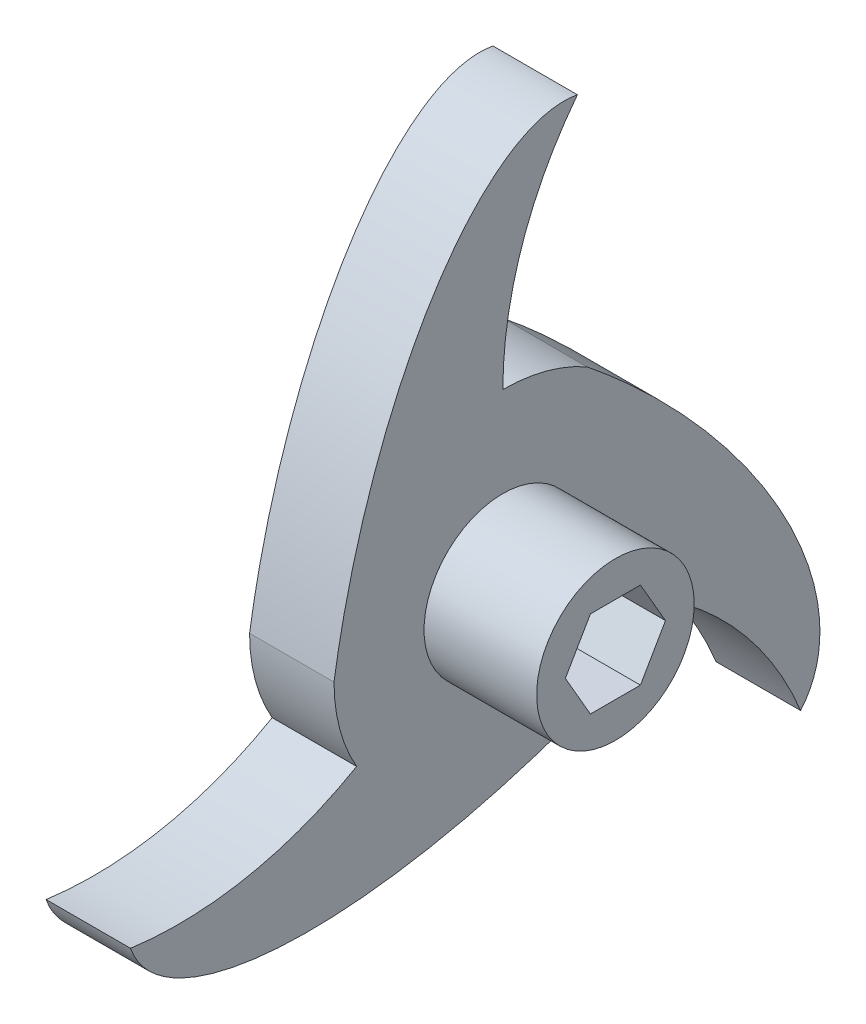
ISO-10303-21;
HEADER;
FILE_DESCRIPTION(('STEP AP214'),'2;1');
FILE_NAME('part.step','',(''),(''),'','','');
FILE_SCHEMA(('AUTOMOTIVE_DESIGN { 1 0 10303 214 1 1 1 1 }'));
ENDSEC;
DATA;
#1=APPLICATION_CONTEXT('core data for automotive mechanical design processes');
#2=APPLICATION_PROTOCOL_DEFINITION('international standard','automotive_design',2000,#1);
#3=PRODUCT_CONTEXT('',#1,'mechanical');
#4=PRODUCT('Part','Part','',(#3));
#5=PRODUCT_RELATED_PRODUCT_CATEGORY('part','',(#4));
#6=PRODUCT_DEFINITION_FORMATION('','',#4);
#7=PRODUCT_DEFINITION_CONTEXT('part definition',#1,'design');
#8=PRODUCT_DEFINITION('design','',#6,#7);
#9=PRODUCT_DEFINITION_SHAPE('','',#8);
#10=(LENGTH_UNIT() NAMED_UNIT(*) SI_UNIT(.MILLI.,.METRE.));
#11=(NAMED_UNIT(*) PLANE_ANGLE_UNIT() SI_UNIT($,.RADIAN.));
#12=(NAMED_UNIT(*) SI_UNIT($,.STERADIAN.) SOLID_ANGLE_UNIT());
#13=UNCERTAINTY_MEASURE_WITH_UNIT(LENGTH_MEASURE(1.E-05),#10,'distance_accuracy_value','');
#14=(GEOMETRIC_REPRESENTATION_CONTEXT(3) GLOBAL_UNCERTAINTY_ASSIGNED_CONTEXT((#13)) GLOBAL_UNIT_ASSIGNED_CONTEXT((#10,
#11,#12)) REPRESENTATION_CONTEXT('',''));
#15=CARTESIAN_POINT('',(0.,0.,0.));
#16=DIRECTION('',(0.,0.,1.));
#17=DIRECTION('',(1.,0.,0.));
#18=AXIS2_PLACEMENT_3D('',#15,#16,#17);
#19=CARTESIAN_POINT('',(9.525,0.,0.));
#20=DIRECTION('',(-1.,0.,0.));
#21=DIRECTION('',(0.,0.,1.));
#22=AXIS2_PLACEMENT_3D('',#19,#20,#21);
#23=CYLINDRICAL_SURFACE('',#22,19.05);
#24=CARTESIAN_POINT('',(0.,0.,0.));
#25=DIRECTION('',(1.,0.,0.));
#26=DIRECTION('',(0.,0.,-1.));
#27=AXIS2_PLACEMENT_3D('',#24,#25,#26);
#28=CIRCLE('',#27,19.05);
#29=CARTESIAN_POINT('',(0.,0.,19.05));
#30=VERTEX_POINT('',#29);
#31=CARTESIAN_POINT('',(0.,-9.52500000000001,16.4977839420936));
#32=VERTEX_POINT('',#31);
#33=EDGE_CURVE('E272',#30,#32,#28,.T.);
#34=ORIENTED_EDGE('',*,*,#33,.T.);
#35=DIRECTION('',(-1.,0.,0.));
#36=VECTOR('',#35,1.);
#37=CARTESIAN_POINT('',(9.525,-9.52500000000001,16.4977839420936));
#38=LINE('',#37,#36);
#39=CARTESIAN_POINT('',(9.525,-9.52500000000001,16.4977839420936));
#40=VERTEX_POINT('',#39);
#41=EDGE_CURVE('E11',#40,#32,#38,.T.);
#42=ORIENTED_EDGE('',*,*,#41,.F.);
#43=CARTESIAN_POINT('',(9.525,0.,0.));
#44=DIRECTION('',(1.,0.,0.));
#45=DIRECTION('',(0.,0.,-1.));
#46=AXIS2_PLACEMENT_3D('',#43,#44,#45);
#47=CIRCLE('',#46,19.05);
#48=CARTESIAN_POINT('',(9.525,0.,19.05));
#49=VERTEX_POINT('',#48);
#50=EDGE_CURVE('E152',#49,#40,#47,.T.);
#51=ORIENTED_EDGE('',*,*,#50,.F.);
#52=DIRECTION('',(-1.,0.,0.));
#53=VECTOR('',#52,1.);
#54=CARTESIAN_POINT('',(9.525,0.,19.05));
#55=LINE('',#54,#53);
#56=EDGE_CURVE('E214',#49,#30,#55,.T.);
#57=ORIENTED_EDGE('',*,*,#56,.T.);
#58=EDGE_LOOP('',(#34,#42,#51,#57));
#59=FACE_BOUND('',#58,.T.);
#60=ADVANCED_FACE('F38',(#59),#23,.T.);
#61=CARTESIAN_POINT('',(9.525,25.255382401578,36.5782470841628));
#62=DIRECTION('',(-1.,0.,0.));
#63=DIRECTION('',(0.,0.,1.));
#64=AXIS2_PLACEMENT_3D('',#61,#62,#63);
#65=CYLINDRICAL_SURFACE('',#64,40.1609262841384);
#66=CARTESIAN_POINT('',(0.,25.255382401578,36.5782470841628));
#67=DIRECTION('',(1.,0.,0.));
#68=DIRECTION('',(0.,0.,-1.));
#69=AXIS2_PLACEMENT_3D('',#66,#67,#68);
#70=CIRCLE('',#69,40.1609262841384);
#71=CARTESIAN_POINT('',(0.,-14.5371206447957,42.0056498980631));
#72=VERTEX_POINT('',#71);
#73=EDGE_CURVE('E275',#32,#72,#70,.F.);
#74=ORIENTED_EDGE('',*,*,#73,.T.);
#75=DIRECTION('',(-1.,0.,0.));
#76=VECTOR('',#75,1.);
#77=CARTESIAN_POINT('',(9.525,-14.5371206447957,42.0056498980631));
#78=LINE('',#77,#76);
#79=CARTESIAN_POINT('',(9.525,-14.5371206447957,42.0056498980631));
#80=VERTEX_POINT('',#79);
#81=EDGE_CURVE('E48',#80,#72,#78,.T.);
#82=ORIENTED_EDGE('',*,*,#81,.F.);
#83=CARTESIAN_POINT('',(9.525,25.255382401578,36.5782470841628));
#84=DIRECTION('',(1.,0.,0.));
#85=DIRECTION('',(0.,0.,-1.));
#86=AXIS2_PLACEMENT_3D('',#83,#84,#85);
#87=CIRCLE('',#86,40.1609262841384);
#88=EDGE_CURVE('E122',#40,#80,#87,.F.);
#89=ORIENTED_EDGE('',*,*,#88,.F.);
#90=ORIENTED_EDGE('',*,*,#41,.T.);
#91=EDGE_LOOP('',(#74,#82,#89,#90));
#92=FACE_BOUND('',#91,.T.);
#93=ADVANCED_FACE('F196',(#92),#65,.F.);
#94=CARTESIAN_POINT('',(9.525,0.,0.));
#95=DIRECTION('',(1.,0.,0.));
#96=DIRECTION('',(0.,-0.327044333966158,0.945008996581849));
#97=AXIS2_PLACEMENT_3D('',#94,#95,#96);
#98=ELLIPSE('',#97,44.45,18.7675000379589);
#99=DIRECTION('',(-1.,0.,0.));
#100=VECTOR('',#99,1.);
#101=SURFACE_OF_LINEAR_EXTRUSION('',#98,#100);
#102=CARTESIAN_POINT('',(0.,0.,0.));
#103=DIRECTION('',(1.,0.,0.));
#104=DIRECTION('',(0.,-0.327044333966158,0.945008996581849));
#105=AXIS2_PLACEMENT_3D('',#102,#103,#104);
#106=ELLIPSE('',#105,44.45,18.7675000379589);
#107=CARTESIAN_POINT('',(0.,-16.4977839420936,-9.52500000000001));
#108=VERTEX_POINT('',#107);
#109=EDGE_CURVE('E278',#72,#108,#106,.T.);
#110=ORIENTED_EDGE('',*,*,#109,.T.);
#111=DIRECTION('',(-1.,0.,0.));
#112=VECTOR('',#111,1.);
#113=CARTESIAN_POINT('',(9.525,-16.4977839420936,-9.52500000000001));
#114=LINE('',#113,#112);
#115=CARTESIAN_POINT('',(9.525,-16.4977839420936,-9.52500000000001));
#116=VERTEX_POINT('',#115);
#117=EDGE_CURVE('E224',#116,#108,#114,.T.);
#118=ORIENTED_EDGE('',*,*,#117,.F.);
#119=EDGE_CURVE('E199',#80,#116,#98,.T.);
#120=ORIENTED_EDGE('',*,*,#119,.F.);
#121=ORIENTED_EDGE('',*,*,#81,.T.);
#122=EDGE_LOOP('',(#110,#118,#120,#121));
#123=FACE_BOUND('',#122,.T.);
#124=ADVANCED_FACE('F192',(#123),#101,.F.);
#125=CARTESIAN_POINT('',(0.,-9.525,-16.4977839420936));
#126=VERTEX_POINT('',#125);
#127=EDGE_CURVE('E276',#108,#126,#28,.T.);
#128=ORIENTED_EDGE('',*,*,#127,.T.);
#129=DIRECTION('',(-1.,0.,0.));
#130=VECTOR('',#129,1.);
#131=CARTESIAN_POINT('',(9.525,-9.525,-16.4977839420936));
#132=LINE('',#131,#130);
#133=CARTESIAN_POINT('',(9.525,-9.525,-16.4977839420936));
#134=VERTEX_POINT('',#133);
#135=EDGE_CURVE('E221',#134,#126,#132,.T.);
#136=ORIENTED_EDGE('',*,*,#135,.F.);
#137=EDGE_CURVE('E151',#116,#134,#47,.T.);
#138=ORIENTED_EDGE('',*,*,#137,.F.);
#139=ORIENTED_EDGE('',*,*,#117,.T.);
#140=EDGE_LOOP('',(#128,#136,#138,#139));
#141=FACE_BOUND('',#140,.T.);
#142=ADVANCED_FACE('F184',(#141),#23,.T.);
#143=CARTESIAN_POINT('',(9.525,-44.3053824015781,3.58267919997563));
#144=DIRECTION('',(-1.,0.,0.));
#145=DIRECTION('',(0.,0.,1.));
#146=AXIS2_PLACEMENT_3D('',#143,#144,#145);
#147=CYLINDRICAL_SURFACE('',#146,40.1609262841384);
#148=CARTESIAN_POINT('',(0.,-44.3053824015781,3.58267919997563));
#149=DIRECTION('',(1.,0.,0.));
#150=DIRECTION('',(0.,0.,-1.));
#151=AXIS2_PLACEMENT_3D('',#148,#149,#150);
#152=CIRCLE('',#151,40.1609262841384);
#153=CARTESIAN_POINT('',(0.,-29.1093995918,-33.5923407253039));
#154=VERTEX_POINT('',#153);
#155=EDGE_CURVE('E280',#126,#154,#152,.F.);
#156=ORIENTED_EDGE('',*,*,#155,.T.);
#157=DIRECTION('',(-1.,0.,0.));
#158=VECTOR('',#157,1.);
#159=CARTESIAN_POINT('',(9.525,-29.1093995918,-33.5923407253039));
#160=LINE('',#159,#158);
#161=CARTESIAN_POINT('',(9.525,-29.1093995918,-33.5923407253039));
#162=VERTEX_POINT('',#161);
#163=EDGE_CURVE('E218',#162,#154,#160,.T.);
#164=ORIENTED_EDGE('',*,*,#163,.F.);
#165=CARTESIAN_POINT('',(9.525,-44.3053824015781,3.58267919997563));
#166=DIRECTION('',(1.,0.,0.));
#167=DIRECTION('',(0.,0.,-1.));
#168=AXIS2_PLACEMENT_3D('',#165,#166,#167);
#169=CIRCLE('',#168,40.1609262841384);
#170=EDGE_CURVE('E202',#134,#162,#169,.F.);
#171=ORIENTED_EDGE('',*,*,#170,.F.);
#172=ORIENTED_EDGE('',*,*,#135,.T.);
#173=EDGE_LOOP('',(#156,#164,#171,#172));
#174=FACE_BOUND('',#173,.T.);
#175=ADVANCED_FACE('F187',(#174),#147,.F.);
#176=CARTESIAN_POINT('',(9.525,0.,0.));
#177=DIRECTION('',(1.,0.,0.));
#178=DIRECTION('',(0.,-0.654879630861643,-0.755733199669379));
#179=AXIS2_PLACEMENT_3D('',#176,#177,#178);
#180=ELLIPSE('',#179,44.45,18.7675000379589);
#181=DIRECTION('',(-1.,0.,0.));
#182=VECTOR('',#181,1.);
#183=SURFACE_OF_LINEAR_EXTRUSION('',#180,#182);
#184=CARTESIAN_POINT('',(0.,0.,0.));
#185=DIRECTION('',(1.,0.,0.));
#186=DIRECTION('',(0.,-0.654879630861643,-0.755733199669379));
#187=AXIS2_PLACEMENT_3D('',#184,#185,#186);
#188=ELLIPSE('',#187,44.45,18.7675000379589);
#189=CARTESIAN_POINT('',(0.,16.4977839420935,-9.52500000000004));
#190=VERTEX_POINT('',#189);
#191=EDGE_CURVE('E281',#154,#190,#188,.T.);
#192=ORIENTED_EDGE('',*,*,#191,.T.);
#193=DIRECTION('',(-1.,0.,0.));
#194=VECTOR('',#193,1.);
#195=CARTESIAN_POINT('',(9.525,16.4977839420935,-9.52500000000004));
#196=LINE('',#195,#194);
#197=CARTESIAN_POINT('',(9.525,16.4977839420935,-9.52500000000004));
#198=VERTEX_POINT('',#197);
#199=EDGE_CURVE('E157',#198,#190,#196,.T.);
#200=ORIENTED_EDGE('',*,*,#199,.F.);
#201=EDGE_CURVE('E146',#162,#198,#180,.T.);
#202=ORIENTED_EDGE('',*,*,#201,.F.);
#203=ORIENTED_EDGE('',*,*,#163,.T.);
#204=EDGE_LOOP('',(#192,#200,#202,#203));
#205=FACE_BOUND('',#204,.T.);
#206=ADVANCED_FACE('F183',(#205),#183,.F.);
#207=CARTESIAN_POINT('',(0.,19.05,0.));
#208=VERTEX_POINT('',#207);
#209=EDGE_CURVE('E156',#190,#208,#28,.T.);
#210=ORIENTED_EDGE('',*,*,#209,.T.);
#211=DIRECTION('',(-1.,0.,0.));
#212=VECTOR('',#211,1.);
#213=CARTESIAN_POINT('',(9.525,19.05,0.));
#214=LINE('',#213,#212);
#215=CARTESIAN_POINT('',(9.525,19.05,0.));
#216=VERTEX_POINT('',#215);
#217=EDGE_CURVE('E153',#216,#208,#214,.T.);
#218=ORIENTED_EDGE('',*,*,#217,.F.);
#219=EDGE_CURVE('E140',#198,#216,#47,.T.);
#220=ORIENTED_EDGE('',*,*,#219,.F.);
#221=ORIENTED_EDGE('',*,*,#199,.T.);
#222=EDGE_LOOP('',(#210,#218,#220,#221));
#223=FACE_BOUND('',#222,.T.);
#224=ADVANCED_FACE('F154',(#223),#23,.T.);
#225=CARTESIAN_POINT('',(9.525,19.05,-40.1609262841384));
#226=DIRECTION('',(-1.,0.,0.));
#227=DIRECTION('',(0.,0.,1.));
#228=AXIS2_PLACEMENT_3D('',#225,#226,#227);
#229=CYLINDRICAL_SURFACE('',#228,40.1609262841384);
#230=CARTESIAN_POINT('',(0.,19.05,-40.1609262841384));
#231=DIRECTION('',(1.,0.,0.));
#232=DIRECTION('',(0.,0.,-1.));
#233=AXIS2_PLACEMENT_3D('',#230,#231,#232);
#234=CIRCLE('',#233,40.1609262841384);
#235=CARTESIAN_POINT('',(0.,43.6465202365958,-8.41330917275927));
#236=VERTEX_POINT('',#235);
#237=EDGE_CURVE('E108',#208,#236,#234,.F.);
#238=ORIENTED_EDGE('',*,*,#237,.T.);
#239=DIRECTION('',(-1.,0.,0.));
#240=VECTOR('',#239,1.);
#241=CARTESIAN_POINT('',(9.525,43.6465202365958,-8.41330917275927));
#242=LINE('',#241,#240);
#243=CARTESIAN_POINT('',(9.525,43.6465202365958,-8.41330917275927));
#244=VERTEX_POINT('',#243);
#245=EDGE_CURVE('E158',#244,#236,#242,.T.);
#246=ORIENTED_EDGE('',*,*,#245,.F.);
#247=CARTESIAN_POINT('',(9.525,19.05,-40.1609262841384));
#248=DIRECTION('',(1.,0.,0.));
#249=DIRECTION('',(0.,0.,-1.));
#250=AXIS2_PLACEMENT_3D('',#247,#248,#249);
#251=CIRCLE('',#250,40.1609262841384);
#252=EDGE_CURVE('E144',#216,#244,#251,.F.);
#253=ORIENTED_EDGE('',*,*,#252,.F.);
#254=ORIENTED_EDGE('',*,*,#217,.T.);
#255=EDGE_LOOP('',(#238,#246,#253,#254));
#256=FACE_BOUND('',#255,.T.);
#257=ADVANCED_FACE('F160',(#256),#229,.F.);
#258=CARTESIAN_POINT('',(9.525,-2.44474999999998,-4.23443121180402));
#259=DIRECTION('',(0.,0.499999999999996,0.866025403784441));
#260=DIRECTION('',(0.,-0.866025403784441,0.499999999999997));
#261=AXIS2_PLACEMENT_3D('',#258,#259,#260);
#262=PLANE('',#261);
#263=DIRECTION('',(0.,0.866025403784441,-0.499999999999997));
#264=VECTOR('',#263,1.);
#265=CARTESIAN_POINT('',(0.,-2.44474999999998,-4.23443121180402));
#266=LINE('',#265,#264);
#267=CARTESIAN_POINT('',(0.,-4.88949999999999,-2.82295414120269));
#268=VERTEX_POINT('',#267);
#269=CARTESIAN_POINT('',(0.,0.,-5.64590828240535));
#270=VERTEX_POINT('',#269);
#271=EDGE_CURVE('E169',#268,#270,#266,.T.);
#272=ORIENTED_EDGE('',*,*,#271,.F.);
#273=DIRECTION('',(-1.,0.,0.));
#274=VECTOR('',#273,1.);
#275=CARTESIAN_POINT('',(9.525,-4.88949999999999,-2.82295414120269));
#276=LINE('',#275,#274);
#277=CARTESIAN_POINT('',(22.225,-4.88949999999999,-2.82295414120269));
#278=VERTEX_POINT('',#277);
#279=EDGE_CURVE('E42',#278,#268,#276,.T.);
#280=ORIENTED_EDGE('',*,*,#279,.F.);
#281=DIRECTION('',(0.,0.866025403784441,-0.499999999999997));
#282=VECTOR('',#281,1.);
#283=CARTESIAN_POINT('',(22.225,-2.44474999999998,-4.23443121180402));
#284=LINE('',#283,#282);
#285=CARTESIAN_POINT('',(22.225,0.,-5.64590828240535));
#286=VERTEX_POINT('',#285);
#287=EDGE_CURVE('E479',#278,#286,#284,.T.);
#288=ORIENTED_EDGE('',*,*,#287,.T.);
#289=DIRECTION('',(-1.,0.,0.));
#290=VECTOR('',#289,1.);
#291=CARTESIAN_POINT('',(9.525,0.,-5.64590828240535));
#292=LINE('',#291,#290);
#293=EDGE_CURVE('E162',#286,#270,#292,.T.);
#294=ORIENTED_EDGE('',*,*,#293,.T.);
#295=EDGE_LOOP('',(#272,#280,#288,#294));
#296=FACE_BOUND('',#295,.T.);
#297=ADVANCED_FACE('F40',(#296),#262,.T.);
#298=CARTESIAN_POINT('',(9.525,-4.8895,0.));
#299=DIRECTION('',(0.,1.,0.));
#300=DIRECTION('',(0.,0.,1.));
#301=AXIS2_PLACEMENT_3D('',#298,#299,#300);
#302=PLANE('',#301);
#303=DIRECTION('',(0.,0.,-1.));
#304=VECTOR('',#303,1.);
#305=CARTESIAN_POINT('',(0.,-4.8895,0.));
#306=LINE('',#305,#304);
#307=CARTESIAN_POINT('',(0.,-4.88950000000001,2.82295414120266));
#308=VERTEX_POINT('',#307);
#309=EDGE_CURVE('E247',#308,#268,#306,.T.);
#310=ORIENTED_EDGE('',*,*,#309,.F.);
#311=DIRECTION('',(-1.,0.,0.));
#312=VECTOR('',#311,1.);
#313=CARTESIAN_POINT('',(9.525,-4.88950000000001,2.82295414120266));
#314=LINE('',#313,#312);
#315=CARTESIAN_POINT('',(22.225,-4.88950000000001,2.82295414120266));
#316=VERTEX_POINT('',#315);
#317=EDGE_CURVE('E235',#316,#308,#314,.T.);
#318=ORIENTED_EDGE('',*,*,#317,.F.);
#319=DIRECTION('',(0.,0.,-1.));
#320=VECTOR('',#319,1.);
#321=CARTESIAN_POINT('',(22.225,-4.8895,0.));
#322=LINE('',#321,#320);
#323=EDGE_CURVE('E251',#316,#278,#322,.T.);
#324=ORIENTED_EDGE('',*,*,#323,.T.);
#325=ORIENTED_EDGE('',*,*,#279,.T.);
#326=EDGE_LOOP('',(#310,#318,#324,#325));
#327=FACE_BOUND('',#326,.T.);
#328=ADVANCED_FACE('F245',(#327),#302,.T.);
#329=CARTESIAN_POINT('',(9.525,-2.44475000000002,4.234431211804));
#330=DIRECTION('',(0.,0.500000000000003,-0.866025403784437));
#331=DIRECTION('',(0.,0.866025403784437,0.500000000000003));
#332=AXIS2_PLACEMENT_3D('',#329,#330,#331);
#333=PLANE('',#332);
#334=DIRECTION('',(0.,-0.866025403784437,-0.500000000000003));
#335=VECTOR('',#334,1.);
#336=CARTESIAN_POINT('',(0.,-2.44475000000002,4.234431211804));
#337=LINE('',#336,#335);
#338=CARTESIAN_POINT('',(0.,0.,5.64590828240535));
#339=VERTEX_POINT('',#338);
#340=EDGE_CURVE('E262',#339,#308,#337,.T.);
#341=ORIENTED_EDGE('',*,*,#340,.F.);
#342=DIRECTION('',(-1.,0.,0.));
#343=VECTOR('',#342,1.);
#344=CARTESIAN_POINT('',(9.525,0.,5.64590828240535));
#345=LINE('',#344,#343);
#346=CARTESIAN_POINT('',(22.225,0.,5.64590828240535));
#347=VERTEX_POINT('',#346);
#348=EDGE_CURVE('E234',#347,#339,#345,.T.);
#349=ORIENTED_EDGE('',*,*,#348,.F.);
#350=DIRECTION('',(0.,-0.866025403784437,-0.500000000000003));
#351=VECTOR('',#350,1.);
#352=CARTESIAN_POINT('',(22.225,-2.44475000000002,4.234431211804));
#353=LINE('',#352,#351);
#354=EDGE_CURVE('E496',#347,#316,#353,.T.);
#355=ORIENTED_EDGE('',*,*,#354,.T.);
#356=ORIENTED_EDGE('',*,*,#317,.T.);
#357=EDGE_LOOP('',(#341,#349,#355,#356));
#358=FACE_BOUND('',#357,.T.);
#359=ADVANCED_FACE('F331',(#358),#333,.T.);
#360=CARTESIAN_POINT('',(9.525,2.44474999999998,4.23443121180402));
#361=DIRECTION('',(0.,-0.499999999999996,-0.866025403784441));
#362=DIRECTION('',(0.,0.866025403784441,-0.499999999999996));
#363=AXIS2_PLACEMENT_3D('',#360,#361,#362);
#364=PLANE('',#363);
#365=DIRECTION('',(0.,-0.866025403784441,0.499999999999997));
#366=VECTOR('',#365,1.);
#367=CARTESIAN_POINT('',(0.,2.44474999999998,4.23443121180402));
#368=LINE('',#367,#366);
#369=CARTESIAN_POINT('',(0.,4.88949999999999,2.82295414120269));
#370=VERTEX_POINT('',#369);
#371=EDGE_CURVE('E263',#370,#339,#368,.T.);
#372=ORIENTED_EDGE('',*,*,#371,.F.);
#373=DIRECTION('',(-1.,0.,0.));
#374=VECTOR('',#373,1.);
#375=CARTESIAN_POINT('',(9.525,4.88949999999999,2.82295414120269));
#376=LINE('',#375,#374);
#377=CARTESIAN_POINT('',(22.225,4.88949999999999,2.82295414120269));
#378=VERTEX_POINT('',#377);
#379=EDGE_CURVE('E232',#378,#370,#376,.T.);
#380=ORIENTED_EDGE('',*,*,#379,.F.);
#381=DIRECTION('',(0.,-0.866025403784441,0.499999999999997));
#382=VECTOR('',#381,1.);
#383=CARTESIAN_POINT('',(22.225,2.44474999999998,4.23443121180402));
#384=LINE('',#383,#382);
#385=EDGE_CURVE('E493',#378,#347,#384,.T.);
#386=ORIENTED_EDGE('',*,*,#385,.T.);
#387=ORIENTED_EDGE('',*,*,#348,.T.);
#388=EDGE_LOOP('',(#372,#380,#386,#387));
#389=FACE_BOUND('',#388,.T.);
#390=ADVANCED_FACE('F337',(#389),#364,.T.);
#391=CARTESIAN_POINT('',(9.525,4.8895,0.));
#392=DIRECTION('',(0.,-1.,0.));
#393=DIRECTION('',(0.,0.,-1.));
#394=AXIS2_PLACEMENT_3D('',#391,#392,#393);
#395=PLANE('',#394);
#396=DIRECTION('',(0.,0.,1.));
#397=VECTOR('',#396,1.);
#398=CARTESIAN_POINT('',(0.,4.8895,0.));
#399=LINE('',#398,#397);
#400=CARTESIAN_POINT('',(0.,4.88950000000001,-2.82295414120266));
#401=VERTEX_POINT('',#400);
#402=EDGE_CURVE('E267',#401,#370,#399,.T.);
#403=ORIENTED_EDGE('',*,*,#402,.F.);
#404=DIRECTION('',(-1.,0.,0.));
#405=VECTOR('',#404,1.);
#406=CARTESIAN_POINT('',(9.525,4.88950000000001,-2.82295414120266));
#407=LINE('',#406,#405);
#408=CARTESIAN_POINT('',(22.225,4.88950000000001,-2.82295414120266));
#409=VERTEX_POINT('',#408);
#410=EDGE_CURVE('E230',#409,#401,#407,.T.);
#411=ORIENTED_EDGE('',*,*,#410,.F.);
#412=DIRECTION('',(0.,0.,1.));
#413=VECTOR('',#412,1.);
#414=CARTESIAN_POINT('',(22.225,4.8895,0.));
#415=LINE('',#414,#413);
#416=EDGE_CURVE('E488',#409,#378,#415,.T.);
#417=ORIENTED_EDGE('',*,*,#416,.T.);
#418=ORIENTED_EDGE('',*,*,#379,.T.);
#419=EDGE_LOOP('',(#403,#411,#417,#418));
#420=FACE_BOUND('',#419,.T.);
#421=ADVANCED_FACE('F344',(#420),#395,.T.);
#422=CARTESIAN_POINT('',(9.525,2.44475000000002,-4.234431211804));
#423=DIRECTION('',(0.,-0.500000000000003,0.866025403784437));
#424=DIRECTION('',(0.,-0.866025403784437,-0.500000000000003));
#425=AXIS2_PLACEMENT_3D('',#422,#423,#424);
#426=PLANE('',#425);
#427=DIRECTION('',(0.,0.866025403784437,0.500000000000004));
#428=VECTOR('',#427,1.);
#429=CARTESIAN_POINT('',(0.,2.44475000000002,-4.234431211804));
#430=LINE('',#429,#428);
#431=EDGE_CURVE('E270',#270,#401,#430,.T.);
#432=ORIENTED_EDGE('',*,*,#431,.F.);
#433=ORIENTED_EDGE('',*,*,#293,.F.);
#434=DIRECTION('',(0.,0.866025403784437,0.500000000000004));
#435=VECTOR('',#434,1.);
#436=CARTESIAN_POINT('',(22.225,2.44475000000002,-4.234431211804));
#437=LINE('',#436,#435);
#438=EDGE_CURVE('E484',#286,#409,#437,.T.);
#439=ORIENTED_EDGE('',*,*,#438,.T.);
#440=ORIENTED_EDGE('',*,*,#410,.T.);
#441=EDGE_LOOP('',(#432,#433,#439,#440));
#442=FACE_BOUND('',#441,.T.);
#443=ADVANCED_FACE('F176',(#442),#426,.T.);
#444=CARTESIAN_POINT('',(9.525,0.,0.));
#445=DIRECTION('',(1.,0.,0.));
#446=DIRECTION('',(0.,0.981923964827802,-0.18927579691247));
#447=AXIS2_PLACEMENT_3D('',#444,#445,#446);
#448=ELLIPSE('',#447,44.45,18.7675000379589);
#449=DIRECTION('',(-1.,0.,0.));
#450=VECTOR('',#449,1.);
#451=SURFACE_OF_LINEAR_EXTRUSION('',#448,#450);
#452=CARTESIAN_POINT('',(0.,0.,0.));
#453=DIRECTION('',(1.,0.,0.));
#454=DIRECTION('',(0.,0.981923964827802,-0.18927579691247));
#455=AXIS2_PLACEMENT_3D('',#452,#453,#454);
#456=ELLIPSE('',#455,44.45,18.7675000379589);
#457=EDGE_CURVE('E114',#236,#30,#456,.T.);
#458=ORIENTED_EDGE('',*,*,#457,.T.);
#459=ORIENTED_EDGE('',*,*,#56,.F.);
#460=EDGE_CURVE('E57',#244,#49,#448,.T.);
#461=ORIENTED_EDGE('',*,*,#460,.F.);
#462=ORIENTED_EDGE('',*,*,#245,.T.);
#463=EDGE_LOOP('',(#458,#459,#461,#462));
#464=FACE_BOUND('',#463,.T.);
#465=ADVANCED_FACE('F172',(#464),#451,.F.);
#466=CARTESIAN_POINT('',(9.525,0.,0.));
#467=DIRECTION('',(1.,0.,0.));
#468=DIRECTION('',(0.,0.,-1.));
#469=AXIS2_PLACEMENT_3D('',#466,#467,#468);
#470=PLANE('',#469);
#471=CARTESIAN_POINT('',(9.525,0.,0.));
#472=DIRECTION('',(1.,0.,0.));
#473=DIRECTION('',(0.,0.,-1.));
#474=AXIS2_PLACEMENT_3D('',#471,#472,#473);
#475=CIRCLE('',#474,8.89);
#476=CARTESIAN_POINT('',(9.525,0.,-8.89));
#477=VERTEX_POINT('',#476);
#478=EDGE_CURVE('E260',#477,#477,#475,.F.);
#479=ORIENTED_EDGE('',*,*,#478,.T.);
#480=EDGE_LOOP('',(#479));
#481=FACE_BOUND('',#480,.T.);
#482=ORIENTED_EDGE('',*,*,#50,.T.);
#483=ORIENTED_EDGE('',*,*,#88,.T.);
#484=ORIENTED_EDGE('',*,*,#119,.T.);
#485=ORIENTED_EDGE('',*,*,#137,.T.);
#486=ORIENTED_EDGE('',*,*,#170,.T.);
#487=ORIENTED_EDGE('',*,*,#201,.T.);
#488=ORIENTED_EDGE('',*,*,#219,.T.);
#489=ORIENTED_EDGE('',*,*,#252,.T.);
#490=ORIENTED_EDGE('',*,*,#460,.T.);
#491=EDGE_LOOP('',(#482,#483,#484,#485,#486,#487,#488,#489,#490));
#492=FACE_BOUND('',#491,.T.);
#493=ADVANCED_FACE('F142',(#481,#492),#470,.T.);
#494=CARTESIAN_POINT('',(0.,0.,0.));
#495=DIRECTION('',(1.,0.,0.));
#496=DIRECTION('',(0.,0.,-1.));
#497=AXIS2_PLACEMENT_3D('',#494,#495,#496);
#498=PLANE('',#497);
#499=ORIENTED_EDGE('',*,*,#33,.F.);
#500=ORIENTED_EDGE('',*,*,#457,.F.);
#501=ORIENTED_EDGE('',*,*,#237,.F.);
#502=ORIENTED_EDGE('',*,*,#209,.F.);
#503=ORIENTED_EDGE('',*,*,#191,.F.);
#504=ORIENTED_EDGE('',*,*,#155,.F.);
#505=ORIENTED_EDGE('',*,*,#127,.F.);
#506=ORIENTED_EDGE('',*,*,#109,.F.);
#507=ORIENTED_EDGE('',*,*,#73,.F.);
#508=EDGE_LOOP('',(#499,#500,#501,#502,#503,#504,#505,#506,#507));
#509=FACE_BOUND('',#508,.T.);
#510=ORIENTED_EDGE('',*,*,#271,.T.);
#511=ORIENTED_EDGE('',*,*,#431,.T.);
#512=ORIENTED_EDGE('',*,*,#402,.T.);
#513=ORIENTED_EDGE('',*,*,#371,.T.);
#514=ORIENTED_EDGE('',*,*,#340,.T.);
#515=ORIENTED_EDGE('',*,*,#309,.T.);
#516=EDGE_LOOP('',(#510,#511,#512,#513,#514,#515));
#517=FACE_BOUND('',#516,.T.);
#518=ADVANCED_FACE('F177',(#509,#517),#498,.F.);
#519=CARTESIAN_POINT('',(22.225,0.,0.));
#520=DIRECTION('',(-1.,0.,0.));
#521=DIRECTION('',(0.,0.,1.));
#522=AXIS2_PLACEMENT_3D('',#519,#520,#521);
#523=CYLINDRICAL_SURFACE('',#522,8.89);
#524=ORIENTED_EDGE('',*,*,#478,.F.);
#525=EDGE_LOOP('',(#524));
#526=FACE_BOUND('',#525,.T.);
#527=CARTESIAN_POINT('',(22.225,0.,0.));
#528=DIRECTION('',(1.,0.,0.));
#529=DIRECTION('',(0.,0.,-1.));
#530=AXIS2_PLACEMENT_3D('',#527,#528,#529);
#531=CIRCLE('',#530,8.89);
#532=CARTESIAN_POINT('',(22.225,0.,-8.89));
#533=VERTEX_POINT('',#532);
#534=EDGE_CURVE('E482',#533,#533,#531,.T.);
#535=ORIENTED_EDGE('',*,*,#534,.F.);
#536=EDGE_LOOP('',(#535));
#537=FACE_BOUND('',#536,.T.);
#538=ADVANCED_FACE('F374',(#526,#537),#523,.T.);
#539=CARTESIAN_POINT('',(22.225,0.,0.));
#540=DIRECTION('',(1.,0.,0.));
#541=DIRECTION('',(0.,0.,-1.));
#542=AXIS2_PLACEMENT_3D('',#539,#540,#541);
#543=PLANE('',#542);
#544=ORIENTED_EDGE('',*,*,#287,.F.);
#545=ORIENTED_EDGE('',*,*,#323,.F.);
#546=ORIENTED_EDGE('',*,*,#354,.F.);
#547=ORIENTED_EDGE('',*,*,#385,.F.);
#548=ORIENTED_EDGE('',*,*,#416,.F.);
#549=ORIENTED_EDGE('',*,*,#438,.F.);
#550=EDGE_LOOP('',(#544,#545,#546,#547,#548,#549));
#551=FACE_BOUND('',#550,.T.);
#552=ORIENTED_EDGE('',*,*,#534,.T.);
#553=EDGE_LOOP('',(#552));
#554=FACE_BOUND('',#553,.T.);
#555=ADVANCED_FACE('F380',(#551,#554),#543,.T.);
#556=CLOSED_SHELL('',(#60,#93,#124,#142,#175,#206,#224,#257,#297,#328,#359,#390,#421,#443,#465,
#493,#518,#538,#555));
#557=MANIFOLD_SOLID_BREP('B2',#556);
#558=ADVANCED_BREP_SHAPE_REPRESENTATION('',(#18,#557),#14);
#559=SHAPE_DEFINITION_REPRESENTATION(#9,#558);
ENDSEC;
END-ISO-10303-21;
